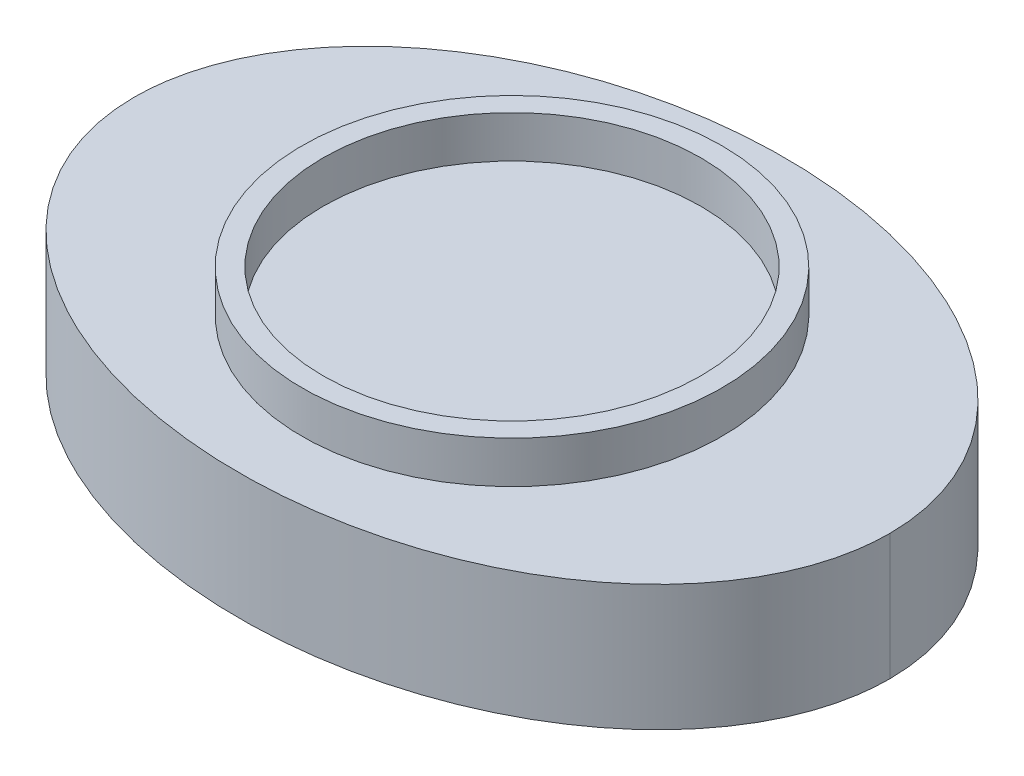
ISO-10303-21;
HEADER;
FILE_DESCRIPTION(('STEP AP214'),'2;1');
FILE_NAME('part.step','',(''),(''),'','','');
FILE_SCHEMA(('AUTOMOTIVE_DESIGN { 1 0 10303 214 1 1 1 1 }'));
ENDSEC;
DATA;
#1=APPLICATION_CONTEXT('core data for automotive mechanical design processes');
#2=APPLICATION_PROTOCOL_DEFINITION('international standard','automotive_design',2000,#1);
#3=PRODUCT_CONTEXT('',#1,'mechanical');
#4=PRODUCT('Part','Part','',(#3));
#5=PRODUCT_RELATED_PRODUCT_CATEGORY('part','',(#4));
#6=PRODUCT_DEFINITION_FORMATION('','',#4);
#7=PRODUCT_DEFINITION_CONTEXT('part definition',#1,'design');
#8=PRODUCT_DEFINITION('design','',#6,#7);
#9=PRODUCT_DEFINITION_SHAPE('','',#8);
#10=(LENGTH_UNIT() NAMED_UNIT(*) SI_UNIT(.MILLI.,.METRE.));
#11=(NAMED_UNIT(*) PLANE_ANGLE_UNIT() SI_UNIT($,.RADIAN.));
#12=(NAMED_UNIT(*) SI_UNIT($,.STERADIAN.) SOLID_ANGLE_UNIT());
#13=UNCERTAINTY_MEASURE_WITH_UNIT(LENGTH_MEASURE(1.E-05),#10,'distance_accuracy_value','');
#14=(GEOMETRIC_REPRESENTATION_CONTEXT(3) GLOBAL_UNCERTAINTY_ASSIGNED_CONTEXT((#13)) GLOBAL_UNIT_ASSIGNED_CONTEXT((#10,
#11,#12)) REPRESENTATION_CONTEXT('',''));
#15=CARTESIAN_POINT('',(0.,0.,0.));
#16=DIRECTION('',(0.,0.,1.));
#17=DIRECTION('',(1.,0.,0.));
#18=AXIS2_PLACEMENT_3D('',#15,#16,#17);
#19=CARTESIAN_POINT('',(0.,3.,0.));
#20=DIRECTION('',(0.,1.,0.));
#21=DIRECTION('',(0.,0.,1.));
#22=AXIS2_PLACEMENT_3D('',#19,#20,#21);
#23=PLANE('',#22);
#24=CARTESIAN_POINT('',(0.,3.,0.));
#25=DIRECTION('',(0.,-1.,0.));
#26=DIRECTION('',(0.,0.,-1.));
#27=AXIS2_PLACEMENT_3D('',#24,#25,#26);
#28=CIRCLE('',#27,4.5);
#29=CARTESIAN_POINT('',(0.,3.,-4.5));
#30=VERTEX_POINT('',#29);
#31=EDGE_CURVE('E20',#30,#30,#28,.F.);
#32=ORIENTED_EDGE('',*,*,#31,.T.);
#33=EDGE_LOOP('',(#32));
#34=FACE_BOUND('',#33,.T.);
#35=ADVANCED_FACE('F17',(#34),#23,.T.);
#36=CARTESIAN_POINT('',(0.,4.,0.));
#37=DIRECTION('',(0.,-1.,0.));
#38=DIRECTION('',(0.,0.,-1.));
#39=AXIS2_PLACEMENT_3D('',#36,#37,#38);
#40=CYLINDRICAL_SURFACE('',#39,4.5);
#41=ORIENTED_EDGE('',*,*,#31,.F.);
#42=EDGE_LOOP('',(#41));
#43=FACE_BOUND('',#42,.T.);
#44=CARTESIAN_POINT('',(0.,4.,0.));
#45=DIRECTION('',(0.,-1.,0.));
#46=DIRECTION('',(0.,0.,-1.));
#47=AXIS2_PLACEMENT_3D('',#44,#45,#46);
#48=CIRCLE('',#47,4.5);
#49=CARTESIAN_POINT('',(0.,4.,-4.5));
#50=VERTEX_POINT('',#49);
#51=EDGE_CURVE('E111',#50,#50,#48,.T.);
#52=ORIENTED_EDGE('',*,*,#51,.F.);
#53=EDGE_LOOP('',(#52));
#54=FACE_BOUND('',#53,.T.);
#55=ADVANCED_FACE('F119',(#43,#54),#40,.F.);
#56=CARTESIAN_POINT('',(0.,4.,0.));
#57=DIRECTION('',(0.,1.,0.));
#58=DIRECTION('',(0.,0.,1.));
#59=AXIS2_PLACEMENT_3D('',#56,#57,#58);
#60=PLANE('',#59);
#61=CARTESIAN_POINT('',(0.,4.,0.));
#62=DIRECTION('',(0.,-1.,0.));
#63=DIRECTION('',(0.,0.,-1.));
#64=AXIS2_PLACEMENT_3D('',#61,#62,#63);
#65=CIRCLE('',#64,5.);
#66=CARTESIAN_POINT('',(0.,4.,-5.));
#67=VERTEX_POINT('',#66);
#68=EDGE_CURVE('E109',#67,#67,#65,.T.);
#69=ORIENTED_EDGE('',*,*,#68,.F.);
#70=EDGE_LOOP('',(#69));
#71=FACE_BOUND('',#70,.T.);
#72=ORIENTED_EDGE('',*,*,#51,.T.);
#73=EDGE_LOOP('',(#72));
#74=FACE_BOUND('',#73,.T.);
#75=ADVANCED_FACE('F122',(#71,#74),#60,.T.);
#76=CARTESIAN_POINT('',(0.,4.,0.));
#77=DIRECTION('',(0.,-1.,0.));
#78=DIRECTION('',(0.,0.,-1.));
#79=AXIS2_PLACEMENT_3D('',#76,#77,#78);
#80=CYLINDRICAL_SURFACE('',#79,5.);
#81=ORIENTED_EDGE('',*,*,#68,.T.);
#82=EDGE_LOOP('',(#81));
#83=FACE_BOUND('',#82,.T.);
#84=CARTESIAN_POINT('',(0.,3.,0.));
#85=DIRECTION('',(0.,-1.,0.));
#86=DIRECTION('',(0.,0.,-1.));
#87=AXIS2_PLACEMENT_3D('',#84,#85,#86);
#88=CIRCLE('',#87,5.);
#89=CARTESIAN_POINT('',(0.,3.,-5.));
#90=VERTEX_POINT('',#89);
#91=EDGE_CURVE('E50',#90,#90,#88,.T.);
#92=ORIENTED_EDGE('',*,*,#91,.F.);
#93=EDGE_LOOP('',(#92));
#94=FACE_BOUND('',#93,.T.);
#95=ADVANCED_FACE('F87',(#83,#94),#80,.T.);
#96=CARTESIAN_POINT('',(0.,3.,0.));
#97=DIRECTION('',(0.,1.,0.));
#98=DIRECTION('',(0.,0.,1.));
#99=AXIS2_PLACEMENT_3D('',#96,#97,#98);
#100=PLANE('',#99);
#101=CARTESIAN_POINT('',(-9.,3.,0.));
#102=CARTESIAN_POINT('',(-9.00002893902373,3.,0.127549969773818));
#103=CARTESIAN_POINT('',(-8.99480285753977,3.,0.255088442349577));
#104=CARTESIAN_POINT('',(-8.97405677653986,3.,0.509268234967433));
#105=CARTESIAN_POINT('',(-8.95854151547113,3.,0.635909940874519));
#106=CARTESIAN_POINT('',(-8.91754170299,3.,0.886874540956104));
#107=CARTESIAN_POINT('',(-8.89211039070337,3.,1.01120616419595));
#108=CARTESIAN_POINT('',(-8.83166230154398,3.,1.25752382151843));
#109=CARTESIAN_POINT('',(-8.79664440855546,3.,1.37950958071336));
#110=CARTESIAN_POINT('',(-8.7151097747714,3.,1.6277957992692));
#111=CARTESIAN_POINT('',(-8.66802458173893,3.,1.75390943564062));
#112=CARTESIAN_POINT('',(-8.56427960835994,3.,2.00218027016195));
#113=CARTESIAN_POINT('',(-8.50761592368228,3.,2.12433583064929));
#114=CARTESIAN_POINT('',(-8.38538465675982,3.,2.36429308555631));
#115=CARTESIAN_POINT('',(-8.31980587464736,3.,2.48208906242689));
#116=CARTESIAN_POINT('',(-8.18055126592551,3.,2.71280343353903));
#117=CARTESIAN_POINT('',(-8.10687375974244,3.,2.82572080923032));
#118=CARTESIAN_POINT('',(-7.91914130645172,3.,3.09351359722164));
#119=CARTESIAN_POINT('',(-7.8012737099325,3.,3.24572913228562));
#120=CARTESIAN_POINT('',(-7.55263077438454,3.,3.53922546808878));
#121=CARTESIAN_POINT('',(-7.42185106192365,3.,3.68050253477731));
#122=CARTESIAN_POINT('',(-7.14904461260543,3.,3.95215975284729));
#123=CARTESIAN_POINT('',(-7.00700105090136,3.,4.08252298159973));
#124=CARTESIAN_POINT('',(-6.71354418248354,3.,4.33211408695893));
#125=CARTESIAN_POINT('',(-6.56213060655358,3.,4.45134164337199));
#126=CARTESIAN_POINT('',(-5.98486752053776,3.,4.87390377353896));
#127=CARTESIAN_POINT('',(-5.53312837335843,3.,5.14283333892189));
#128=CARTESIAN_POINT('',(-4.82875295429743,3.,5.48908674365101));
#129=CARTESIAN_POINT('',(-4.58924076916107,3.,5.59506026843592));
#130=CARTESIAN_POINT('',(-4.10284419889853,3.,5.78876711024874));
#131=CARTESIAN_POINT('',(-3.8559597739903,3.,5.87650032882804));
#132=CARTESIAN_POINT('',(-3.28738588736724,3.,6.05609619410672));
#133=CARTESIAN_POINT('',(-2.96393184254623,3.,6.14236152852256));
#134=CARTESIAN_POINT('',(-2.31079710186416,3.,6.28693886006433));
#135=CARTESIAN_POINT('',(-1.98111477460052,3.,6.34524342474886));
#136=CARTESIAN_POINT('',(-1.31779363834561,3.,6.43456406744096));
#137=CARTESIAN_POINT('',(-0.984151566211739,3.,6.46555578799902));
#138=CARTESIAN_POINT('',(-0.315495902124826,3.,6.50051399755586));
#139=CARTESIAN_POINT('',(0.0195175582765885,3.,6.50448302063715));
#140=CARTESIAN_POINT('',(0.691686946942835,3.,6.48536572639496));
#141=CARTESIAN_POINT('',(1.02883625147836,3.,6.46204442015333));
#142=CARTESIAN_POINT('',(1.70013170767236,3.,6.38768200552451));
#143=CARTESIAN_POINT('',(2.03427744332757,3.,6.33663711568966));
#144=CARTESIAN_POINT('',(2.69663514364929,3.,6.20631634253648));
#145=CARTESIAN_POINT('',(3.02485361104446,3.,6.1270736563876));
#146=CARTESIAN_POINT('',(3.67282004815529,3.,5.9394673345651));
#147=CARTESIAN_POINT('',(3.99257133021226,3.,5.8311152769618));
#148=CARTESIAN_POINT('',(4.52762321387958,3.,5.62054636433278));
#149=CARTESIAN_POINT('',(4.7459342013085,3.,5.52593262490374));
#150=CARTESIAN_POINT('',(5.17516484339017,3.,5.3211573789485));
#151=CARTESIAN_POINT('',(5.38608490826475,3.,5.21099673704098));
#152=CARTESIAN_POINT('',(5.79851991341557,3.,4.97475947100421));
#153=CARTESIAN_POINT('',(6.00004653621213,3.,4.84870338069396));
#154=CARTESIAN_POINT('',(6.39181585119987,3.,4.5801489730918));
#155=CARTESIAN_POINT('',(6.58205736370133,3.,4.43764894140125));
#156=CARTESIAN_POINT('',(7.04260127859859,3.,4.0584794835897));
#157=CARTESIAN_POINT('',(7.30420608662375,3.,3.81086896169006));
#158=CARTESIAN_POINT('',(7.6644087559008,3.,3.41095316865324));
#159=CARTESIAN_POINT('',(7.77910148448862,3.,3.27290933884175));
#160=CARTESIAN_POINT('',(7.99626194601808,3.,2.98746638551199));
#161=CARTESIAN_POINT('',(8.09873227529421,3.,2.84006925908937));
#162=CARTESIAN_POINT('',(8.27185548715404,3.,2.56482220242746));
#163=CARTESIAN_POINT('',(8.34487736912533,3.,2.43845797556506));
#164=CARTESIAN_POINT('',(8.48070646025307,3.,2.18036227635893));
#165=CARTESIAN_POINT('',(8.54351577193726,3.,2.04863191577719));
#166=CARTESIAN_POINT('',(8.65789296819306,3.,1.78061302067102));
#167=CARTESIAN_POINT('',(8.70947908535073,3.,1.64433230028945));
#168=CARTESIAN_POINT('',(8.80065893827632,3.,1.36786831157127));
#169=CARTESIAN_POINT('',(8.84025630395741,3.,1.22768623853759));
#170=CARTESIAN_POINT('',(8.91517631824024,3.,0.908323293058997));
#171=CARTESIAN_POINT('',(8.94687056617571,3.,0.728264830157022));
#172=CARTESIAN_POINT('',(8.9786849964936,3.,0.456300640878521));
#173=CARTESIAN_POINT('',(8.98666873348374,3.,0.365248652577104));
#174=CARTESIAN_POINT('',(8.99732845214193,3.,0.182805829338362));
#175=CARTESIAN_POINT('',(9.00000275254287,3.,0.09141489624717));
#176=CARTESIAN_POINT('',(9.,3.,0.));
#177=B_SPLINE_CURVE_WITH_KNOTS('',3,(#101,#102,#103,#104,#105,#106,#107,#108,#109,#110,#111,
#112,#113,#114,#115,#116,#117,#118,#119,#120,#121,#122,#123,#124,#125,#126,#127,#128,#129,#130,
#131,#132,#133,#134,#135,#136,#137,#138,#139,#140,#141,#142,#143,#144,#145,#146,#147,#148,#149,
#150,#151,#152,#153,#154,#155,#156,#157,#158,#159,#160,#161,#162,#163,#164,#165,#166,#167,#168,
#169,#170,#171,#172,#173,#174,#175,#176),.UNSPECIFIED.,.F.,.F.,(4,2,2,2,2,2,2,2,2,2,2,2,2,2,2,2,
2,2,2,2,2,2,2,2,2,2,2,2,2,2,2,2,2,2,2,2,2,4),(0.,0.38252470016884,0.764873359524244,
1.14519685143168,1.52556464127154,1.92899427498546,2.33258875071799,2.73669502252107,
3.14088525957392,3.71757450897498,4.2944597619221,4.87222355665316,5.4500039592194,
7.01732305260337,7.80259398828204,8.58786916220254,9.59083290471617,10.5940631042349,
11.5981870764189,12.6022168845009,13.6149561014368,14.6278334889105,15.6395223432052,
16.6508093988086,17.3640528070148,18.0772565648314,18.7895482639452,19.5019142917767,
20.5778794682944,21.1157812748079,21.6535686136459,22.0909910800023,22.5283233770339,
22.964939813233,23.4014239196929,23.9485593296398,24.2226310475784,24.4967895382493),.UNSPECIFIED.);
#178=CARTESIAN_POINT('',(-9.,3.,0.));
#179=VERTEX_POINT('',#178);
#180=CARTESIAN_POINT('',(9.,3.,0.));
#181=VERTEX_POINT('',#180);
#182=EDGE_CURVE('E43',#179,#181,#177,.T.);
#183=ORIENTED_EDGE('',*,*,#182,.T.);
#184=CARTESIAN_POINT('',(9.,3.,0.));
#185=CARTESIAN_POINT('',(9.00002893902373,3.,-0.127549969773818));
#186=CARTESIAN_POINT('',(8.99480285753977,3.,-0.255088442349576));
#187=CARTESIAN_POINT('',(8.97405677653986,3.,-0.509268234967432));
#188=CARTESIAN_POINT('',(8.95854151547113,3.,-0.635909940874518));
#189=CARTESIAN_POINT('',(8.91754170299,3.,-0.886874540956103));
#190=CARTESIAN_POINT('',(8.89211039070337,3.,-1.01120616419595));
#191=CARTESIAN_POINT('',(8.83166230154398,3.,-1.25752382151843));
#192=CARTESIAN_POINT('',(8.79664440855546,3.,-1.37950958071336));
#193=CARTESIAN_POINT('',(8.7151097747714,3.,-1.6277957992692));
#194=CARTESIAN_POINT('',(8.66802458173892,3.,-1.75390943564062));
#195=CARTESIAN_POINT('',(8.56427960835994,3.,-2.00218027016195));
#196=CARTESIAN_POINT('',(8.50761592368228,3.,-2.12433583064929));
#197=CARTESIAN_POINT('',(8.38538465675982,3.,-2.36429308555631));
#198=CARTESIAN_POINT('',(8.31980587464736,3.,-2.48208906242689));
#199=CARTESIAN_POINT('',(8.18055126592551,3.,-2.71280343353903));
#200=CARTESIAN_POINT('',(8.10687375974244,3.,-2.82572080923032));
#201=CARTESIAN_POINT('',(7.91914130645172,3.,-3.09351359722164));
#202=CARTESIAN_POINT('',(7.8012737099325,3.,-3.24572913228561));
#203=CARTESIAN_POINT('',(7.55263077438454,3.,-3.53922546808878));
#204=CARTESIAN_POINT('',(7.42185106192365,3.,-3.68050253477731));
#205=CARTESIAN_POINT('',(7.14904461260543,3.,-3.95215975284729));
#206=CARTESIAN_POINT('',(7.00700105090136,3.,-4.08252298159973));
#207=CARTESIAN_POINT('',(6.71354418248353,3.,-4.33211408695893));
#208=CARTESIAN_POINT('',(6.56213060655358,3.,-4.45134164337199));
#209=CARTESIAN_POINT('',(5.98486752053776,3.,-4.87390377353897));
#210=CARTESIAN_POINT('',(5.53312837335843,3.,-5.14283333892189));
#211=CARTESIAN_POINT('',(4.82875295429742,3.,-5.48908674365101));
#212=CARTESIAN_POINT('',(4.58924076916107,3.,-5.59506026843592));
#213=CARTESIAN_POINT('',(4.10284419889853,3.,-5.78876711024875));
#214=CARTESIAN_POINT('',(3.8559597739903,3.,-5.87650032882804));
#215=CARTESIAN_POINT('',(3.28738588736723,3.,-6.05609619410672));
#216=CARTESIAN_POINT('',(2.96393184254623,3.,-6.14236152852256));
#217=CARTESIAN_POINT('',(2.31079710186416,3.,-6.28693886006433));
#218=CARTESIAN_POINT('',(1.98111477460052,3.,-6.34524342474886));
#219=CARTESIAN_POINT('',(1.3177936383456,3.,-6.43456406744096));
#220=CARTESIAN_POINT('',(0.984151566211728,3.,-6.46555578799902));
#221=CARTESIAN_POINT('',(0.315495902124813,3.,-6.50051399755586));
#222=CARTESIAN_POINT('',(-0.0195175582766024,3.,-6.50448302063715));
#223=CARTESIAN_POINT('',(-0.69168694694285,3.,-6.48536572639496));
#224=CARTESIAN_POINT('',(-1.02883625147838,3.,-6.46204442015333));
#225=CARTESIAN_POINT('',(-1.70013170767238,3.,-6.38768200552451));
#226=CARTESIAN_POINT('',(-2.03427744332758,3.,-6.33663711568966));
#227=CARTESIAN_POINT('',(-2.69663514364931,3.,-6.20631634253647));
#228=CARTESIAN_POINT('',(-3.02485361104447,3.,-6.1270736563876));
#229=CARTESIAN_POINT('',(-3.6728200481553,3.,-5.93946733456509));
#230=CARTESIAN_POINT('',(-3.99257133021228,3.,-5.8311152769618));
#231=CARTESIAN_POINT('',(-4.52762321387959,3.,-5.62054636433277));
#232=CARTESIAN_POINT('',(-4.74593420130851,3.,-5.52593262490374));
#233=CARTESIAN_POINT('',(-5.17516484339018,3.,-5.3211573789485));
#234=CARTESIAN_POINT('',(-5.38608490826476,3.,-5.21099673704097));
#235=CARTESIAN_POINT('',(-5.79851991341559,3.,-4.97475947100421));
#236=CARTESIAN_POINT('',(-6.00004653621214,3.,-4.84870338069396));
#237=CARTESIAN_POINT('',(-6.39181585119988,3.,-4.5801489730918));
#238=CARTESIAN_POINT('',(-6.58205736370134,3.,-4.43764894140124));
#239=CARTESIAN_POINT('',(-7.0426012785986,3.,-4.05847948358969));
#240=CARTESIAN_POINT('',(-7.30420608662375,3.,-3.81086896169005));
#241=CARTESIAN_POINT('',(-7.6644087559008,3.,-3.41095316865323));
#242=CARTESIAN_POINT('',(-7.77910148448863,3.,-3.27290933884174));
#243=CARTESIAN_POINT('',(-7.99626194601809,3.,-2.98746638551198));
#244=CARTESIAN_POINT('',(-8.09873227529422,3.,-2.84006925908936));
#245=CARTESIAN_POINT('',(-8.27185548715404,3.,-2.56482220242745));
#246=CARTESIAN_POINT('',(-8.34487736912533,3.,-2.43845797556505));
#247=CARTESIAN_POINT('',(-8.48070646025307,3.,-2.18036227635892));
#248=CARTESIAN_POINT('',(-8.54351577193727,3.,-2.04863191577718));
#249=CARTESIAN_POINT('',(-8.65789296819306,3.,-1.78061302067101));
#250=CARTESIAN_POINT('',(-8.70947908535074,3.,-1.64433230028944));
#251=CARTESIAN_POINT('',(-8.80065893827632,3.,-1.36786831157126));
#252=CARTESIAN_POINT('',(-8.84025630395742,3.,-1.22768623853758));
#253=CARTESIAN_POINT('',(-8.91517631824024,3.,-0.908323293058989));
#254=CARTESIAN_POINT('',(-8.94687056617571,3.,-0.728264830157016));
#255=CARTESIAN_POINT('',(-8.97868499649361,3.,-0.456300640878517));
#256=CARTESIAN_POINT('',(-8.98666873348374,3.,-0.365248652577101));
#257=CARTESIAN_POINT('',(-8.99732845214193,3.,-0.18280582933836));
#258=CARTESIAN_POINT('',(-9.00000275254287,3.,-0.0914148962471687));
#259=CARTESIAN_POINT('',(-9.,3.,0.));
#260=B_SPLINE_CURVE_WITH_KNOTS('',3,(#184,#185,#186,#187,#188,#189,#190,#191,#192,#193,#194,
#195,#196,#197,#198,#199,#200,#201,#202,#203,#204,#205,#206,#207,#208,#209,#210,#211,#212,#213,
#214,#215,#216,#217,#218,#219,#220,#221,#222,#223,#224,#225,#226,#227,#228,#229,#230,#231,#232,
#233,#234,#235,#236,#237,#238,#239,#240,#241,#242,#243,#244,#245,#246,#247,#248,#249,#250,#251,
#252,#253,#254,#255,#256,#257,#258,#259),.UNSPECIFIED.,.F.,.F.,(4,2,2,2,2,2,2,2,2,2,2,2,2,2,2,2,
2,2,2,2,2,2,2,2,2,2,2,2,2,2,2,2,2,2,2,2,2,4),(0.,0.38252470016884,0.764873359524244,
1.14519685143168,1.52556464127154,1.92899427498546,2.33258875071799,2.73669502252107,
3.14088525957393,3.71757450897499,4.2944597619221,4.87222355665317,5.4500039592194,
7.01732305260337,7.80259398828204,8.58786916220254,9.59083290471618,10.5940631042349,
11.598187076419,12.6022168845009,13.6149561014368,14.6278334889105,15.6395223432052,
16.6508093988086,17.3640528070149,18.0772565648314,18.7895482639452,19.5019142917767,
20.5778794682944,21.1157812748079,21.6535686136459,22.0909910800023,22.5283233770339,
22.964939813233,23.4014239196929,23.9485593296398,24.2226310475784,24.4967895382493),.UNSPECIFIED.);
#261=EDGE_CURVE('E49',#181,#179,#260,.T.);
#262=ORIENTED_EDGE('',*,*,#261,.T.);
#263=EDGE_LOOP('',(#183,#262));
#264=FACE_BOUND('',#263,.T.);
#265=ORIENTED_EDGE('',*,*,#91,.T.);
#266=EDGE_LOOP('',(#265));
#267=FACE_BOUND('',#266,.T.);
#268=ADVANCED_FACE('F47',(#264,#267),#100,.T.);
#269=CARTESIAN_POINT('',(-9.,3.,0.));
#270=CARTESIAN_POINT('',(-9.,0.,0.));
#271=CARTESIAN_POINT('',(-9.,3.,13.));
#272=CARTESIAN_POINT('',(-9.,0.,13.));
#273=CARTESIAN_POINT('',(9.,3.,13.));
#274=CARTESIAN_POINT('',(9.,0.,13.));
#275=CARTESIAN_POINT('',(9.,3.,0.));
#276=CARTESIAN_POINT('',(9.,0.,0.));
#277=(BOUNDED_SURFACE() B_SPLINE_SURFACE(3,1,((#269,#270),(#271,#272),(#273,#274),(#275,#276)),
.UNSPECIFIED.,.F.,.F.,.F.) B_SPLINE_SURFACE_WITH_KNOTS((4,4),(2,2),(0.,1.),(0.,1.),
.UNSPECIFIED.) GEOMETRIC_REPRESENTATION_ITEM() RATIONAL_B_SPLINE_SURFACE(((1.,1.),
(0.333333333333,0.333333333333),(0.333333333333,0.333333333333),(1.,1.))) REPRESENTATION_ITEM('') SURFACE());
#278=CARTESIAN_POINT('',(-9.,0.,0.));
#279=CARTESIAN_POINT('',(-9.00002893902373,0.,0.127549969773818));
#280=CARTESIAN_POINT('',(-8.99480285753976,0.,0.255088442349577));
#281=CARTESIAN_POINT('',(-8.97405677653986,0.,0.509268234967433));
#282=CARTESIAN_POINT('',(-8.95854151547114,0.,0.635909940874519));
#283=CARTESIAN_POINT('',(-8.91754170299,0.,0.886874540956104));
#284=CARTESIAN_POINT('',(-8.89211039070337,0.,1.01120616419595));
#285=CARTESIAN_POINT('',(-8.83166230154398,0.,1.25752382151843));
#286=CARTESIAN_POINT('',(-8.79664440855546,0.,1.37950958071336));
#287=CARTESIAN_POINT('',(-8.7151097747714,0.,1.6277957992692));
#288=CARTESIAN_POINT('',(-8.66802458173893,0.,1.75390943564062));
#289=CARTESIAN_POINT('',(-8.56427960835994,0.,2.00218027016195));
#290=CARTESIAN_POINT('',(-8.50761592368228,0.,2.12433583064929));
#291=CARTESIAN_POINT('',(-8.38538465675982,0.,2.36429308555631));
#292=CARTESIAN_POINT('',(-8.31980587464736,0.,2.48208906242689));
#293=CARTESIAN_POINT('',(-8.18055126592551,0.,2.71280343353903));
#294=CARTESIAN_POINT('',(-8.10687375974244,0.,2.82572080923032));
#295=CARTESIAN_POINT('',(-7.91914130645172,0.,3.09351359722164));
#296=CARTESIAN_POINT('',(-7.8012737099325,0.,3.24572913228562));
#297=CARTESIAN_POINT('',(-7.55263077438454,0.,3.53922546808878));
#298=CARTESIAN_POINT('',(-7.42185106192365,0.,3.68050253477731));
#299=CARTESIAN_POINT('',(-7.14904461260543,0.,3.95215975284729));
#300=CARTESIAN_POINT('',(-7.00700105090136,0.,4.08252298159973));
#301=CARTESIAN_POINT('',(-6.71354418248354,0.,4.33211408695893));
#302=CARTESIAN_POINT('',(-6.56213060655358,0.,4.45134164337199));
#303=CARTESIAN_POINT('',(-5.98486752053776,0.,4.87390377353896));
#304=CARTESIAN_POINT('',(-5.53312837335843,0.,5.14283333892189));
#305=CARTESIAN_POINT('',(-4.82875295429743,0.,5.48908674365101));
#306=CARTESIAN_POINT('',(-4.58924076916107,0.,5.59506026843592));
#307=CARTESIAN_POINT('',(-4.10284419889853,0.,5.78876711024874));
#308=CARTESIAN_POINT('',(-3.8559597739903,0.,5.87650032882804));
#309=CARTESIAN_POINT('',(-3.28738588736724,0.,6.05609619410672));
#310=CARTESIAN_POINT('',(-2.96393184254623,0.,6.14236152852256));
#311=CARTESIAN_POINT('',(-2.31079710186416,0.,6.28693886006433));
#312=CARTESIAN_POINT('',(-1.98111477460052,0.,6.34524342474886));
#313=CARTESIAN_POINT('',(-1.31779363834561,0.,6.43456406744096));
#314=CARTESIAN_POINT('',(-0.984151566211739,0.,6.46555578799902));
#315=CARTESIAN_POINT('',(-0.315495902124826,0.,6.50051399755586));
#316=CARTESIAN_POINT('',(0.0195175582765885,0.,6.50448302063715));
#317=CARTESIAN_POINT('',(0.691686946942835,0.,6.48536572639496));
#318=CARTESIAN_POINT('',(1.02883625147836,0.,6.46204442015333));
#319=CARTESIAN_POINT('',(1.70013170767236,0.,6.38768200552451));
#320=CARTESIAN_POINT('',(2.03427744332757,0.,6.33663711568966));
#321=CARTESIAN_POINT('',(2.69663514364929,0.,6.20631634253648));
#322=CARTESIAN_POINT('',(3.02485361104446,0.,6.1270736563876));
#323=CARTESIAN_POINT('',(3.67282004815528,0.,5.9394673345651));
#324=CARTESIAN_POINT('',(3.99257133021226,0.,5.8311152769618));
#325=CARTESIAN_POINT('',(4.52762321387958,0.,5.62054636433278));
#326=CARTESIAN_POINT('',(4.7459342013085,0.,5.52593262490374));
#327=CARTESIAN_POINT('',(5.17516484339017,0.,5.3211573789485));
#328=CARTESIAN_POINT('',(5.38608490826475,0.,5.21099673704098));
#329=CARTESIAN_POINT('',(5.79851991341557,0.,4.97475947100421));
#330=CARTESIAN_POINT('',(6.00004653621213,0.,4.84870338069397));
#331=CARTESIAN_POINT('',(6.39181585119987,0.,4.5801489730918));
#332=CARTESIAN_POINT('',(6.58205736370133,0.,4.43764894140125));
#333=CARTESIAN_POINT('',(7.04260127859859,0.,4.05847948358969));
#334=CARTESIAN_POINT('',(7.30420608662375,0.,3.81086896169006));
#335=CARTESIAN_POINT('',(7.6644087559008,0.,3.41095316865324));
#336=CARTESIAN_POINT('',(7.77910148448862,0.,3.27290933884175));
#337=CARTESIAN_POINT('',(7.99626194601808,0.,2.98746638551199));
#338=CARTESIAN_POINT('',(8.09873227529421,0.,2.84006925908937));
#339=CARTESIAN_POINT('',(8.27185548715404,0.,2.56482220242746));
#340=CARTESIAN_POINT('',(8.34487736912532,0.,2.43845797556506));
#341=CARTESIAN_POINT('',(8.48070646025306,0.,2.18036227635893));
#342=CARTESIAN_POINT('',(8.54351577193726,0.,2.04863191577719));
#343=CARTESIAN_POINT('',(8.65789296819306,0.,1.78061302067102));
#344=CARTESIAN_POINT('',(8.70947908535073,0.,1.64433230028945));
#345=CARTESIAN_POINT('',(8.80065893827632,0.,1.36786831157127));
#346=CARTESIAN_POINT('',(8.84025630395741,0.,1.22768623853759));
#347=CARTESIAN_POINT('',(8.91517631824024,0.,0.908323293058997));
#348=CARTESIAN_POINT('',(8.94687056617571,0.,0.728264830157022));
#349=CARTESIAN_POINT('',(8.9786849964936,0.,0.456300640878521));
#350=CARTESIAN_POINT('',(8.98666873348374,0.,0.365248652577104));
#351=CARTESIAN_POINT('',(8.99732845214193,0.,0.182805829338362));
#352=CARTESIAN_POINT('',(9.00000275254287,0.,0.09141489624717));
#353=CARTESIAN_POINT('',(9.,0.,0.));
#354=B_SPLINE_CURVE_WITH_KNOTS('',3,(#278,#279,#280,#281,#282,#283,#284,#285,#286,#287,#288,
#289,#290,#291,#292,#293,#294,#295,#296,#297,#298,#299,#300,#301,#302,#303,#304,#305,#306,#307,
#308,#309,#310,#311,#312,#313,#314,#315,#316,#317,#318,#319,#320,#321,#322,#323,#324,#325,#326,
#327,#328,#329,#330,#331,#332,#333,#334,#335,#336,#337,#338,#339,#340,#341,#342,#343,#344,#345,
#346,#347,#348,#349,#350,#351,#352,#353),.UNSPECIFIED.,.F.,.F.,(4,2,2,2,2,2,2,2,2,2,2,2,2,2,2,2,
2,2,2,2,2,2,2,2,2,2,2,2,2,2,2,2,2,2,2,2,2,4),(0.,0.38252470016884,0.764873359524244,
1.14519685143168,1.52556464127154,1.92899427498546,2.33258875071799,2.73669502252107,
3.14088525957392,3.71757450897498,4.2944597619221,4.87222355665316,5.4500039592194,
7.01732305260337,7.80259398828204,8.58786916220254,9.59083290471617,10.5940631042349,
11.5981870764189,12.6022168845009,13.6149561014368,14.6278334889105,15.6395223432052,
16.6508093988086,17.3640528070148,18.0772565648314,18.7895482639452,19.5019142917767,
20.5778794682944,21.1157812748079,21.6535686136459,22.0909910800023,22.5283233770339,
22.964939813233,23.4014239196929,23.9485593296398,24.2226310475784,24.4967895382493),.UNSPECIFIED.);
#355=CARTESIAN_POINT('',(-9.,0.,0.));
#356=VERTEX_POINT('',#355);
#357=CARTESIAN_POINT('',(9.,0.,0.));
#358=VERTEX_POINT('',#357);
#359=EDGE_CURVE('E26',#356,#358,#354,.T.);
#360=DIRECTION('',(0.,1.,0.));
#361=VECTOR('',#360,1.);
#362=CARTESIAN_POINT('',(9.,1.5,0.));
#363=LINE('',#362,#361);
#364=EDGE_CURVE('E34',#358,#181,#363,.T.);
#365=DIRECTION('',(0.,-1.,0.));
#366=VECTOR('',#365,1.);
#367=CARTESIAN_POINT('',(-9.,1.5,0.));
#368=LINE('',#367,#366);
#369=EDGE_CURVE('E53',#179,#356,#368,.T.);
#370=ORIENTED_EDGE('',*,*,#359,.T.);
#371=ORIENTED_EDGE('',*,*,#364,.T.);
#372=ORIENTED_EDGE('',*,*,#182,.F.);
#373=ORIENTED_EDGE('',*,*,#369,.T.);
#374=EDGE_LOOP('',(#370,#371,#372,#373));
#375=FACE_BOUND('',#374,.T.);
#376=ADVANCED_FACE('F56',(#375),#277,.F.);
#377=CARTESIAN_POINT('',(9.,3.,0.));
#378=CARTESIAN_POINT('',(9.,0.,0.));
#379=CARTESIAN_POINT('',(9.,3.,-13.));
#380=CARTESIAN_POINT('',(9.,0.,-13.));
#381=CARTESIAN_POINT('',(-9.,3.,-13.));
#382=CARTESIAN_POINT('',(-9.,0.,-13.));
#383=CARTESIAN_POINT('',(-9.,3.,0.));
#384=CARTESIAN_POINT('',(-9.,0.,0.));
#385=(BOUNDED_SURFACE() B_SPLINE_SURFACE(3,1,((#377,#378),(#379,#380),(#381,#382),(#383,#384)),
.UNSPECIFIED.,.F.,.F.,.F.) B_SPLINE_SURFACE_WITH_KNOTS((4,4),(2,2),(0.,1.),(0.,1.),
.UNSPECIFIED.) GEOMETRIC_REPRESENTATION_ITEM() RATIONAL_B_SPLINE_SURFACE(((1.,1.),
(0.333333333333,0.333333333333),(0.333333333333,0.333333333333),(1.,1.))) REPRESENTATION_ITEM('') SURFACE());
#386=CARTESIAN_POINT('',(9.,0.,0.));
#387=CARTESIAN_POINT('',(9.00002893902373,0.,-0.127549969773818));
#388=CARTESIAN_POINT('',(8.99480285753977,0.,-0.255088442349576));
#389=CARTESIAN_POINT('',(8.97405677653986,0.,-0.509268234967432));
#390=CARTESIAN_POINT('',(8.95854151547113,0.,-0.635909940874518));
#391=CARTESIAN_POINT('',(8.91754170299,0.,-0.886874540956103));
#392=CARTESIAN_POINT('',(8.89211039070337,0.,-1.01120616419595));
#393=CARTESIAN_POINT('',(8.83166230154398,0.,-1.25752382151843));
#394=CARTESIAN_POINT('',(8.79664440855546,0.,-1.37950958071336));
#395=CARTESIAN_POINT('',(8.7151097747714,0.,-1.6277957992692));
#396=CARTESIAN_POINT('',(8.66802458173893,0.,-1.75390943564062));
#397=CARTESIAN_POINT('',(8.56427960835994,0.,-2.00218027016195));
#398=CARTESIAN_POINT('',(8.50761592368228,0.,-2.12433583064929));
#399=CARTESIAN_POINT('',(8.38538465675982,0.,-2.36429308555631));
#400=CARTESIAN_POINT('',(8.31980587464736,0.,-2.48208906242689));
#401=CARTESIAN_POINT('',(8.18055126592551,0.,-2.71280343353903));
#402=CARTESIAN_POINT('',(8.10687375974244,0.,-2.82572080923032));
#403=CARTESIAN_POINT('',(7.91914130645172,0.,-3.09351359722164));
#404=CARTESIAN_POINT('',(7.8012737099325,0.,-3.24572913228561));
#405=CARTESIAN_POINT('',(7.55263077438454,0.,-3.53922546808878));
#406=CARTESIAN_POINT('',(7.42185106192365,0.,-3.68050253477731));
#407=CARTESIAN_POINT('',(7.14904461260543,0.,-3.95215975284729));
#408=CARTESIAN_POINT('',(7.00700105090136,0.,-4.08252298159973));
#409=CARTESIAN_POINT('',(6.71354418248353,0.,-4.33211408695893));
#410=CARTESIAN_POINT('',(6.56213060655358,0.,-4.45134164337199));
#411=CARTESIAN_POINT('',(5.98486752053776,0.,-4.87390377353897));
#412=CARTESIAN_POINT('',(5.53312837335843,0.,-5.14283333892189));
#413=CARTESIAN_POINT('',(4.82875295429742,0.,-5.48908674365101));
#414=CARTESIAN_POINT('',(4.58924076916107,0.,-5.59506026843592));
#415=CARTESIAN_POINT('',(4.10284419889853,0.,-5.78876711024875));
#416=CARTESIAN_POINT('',(3.8559597739903,0.,-5.87650032882804));
#417=CARTESIAN_POINT('',(3.28738588736723,0.,-6.05609619410672));
#418=CARTESIAN_POINT('',(2.96393184254623,0.,-6.14236152852256));
#419=CARTESIAN_POINT('',(2.31079710186416,0.,-6.28693886006433));
#420=CARTESIAN_POINT('',(1.98111477460052,0.,-6.34524342474886));
#421=CARTESIAN_POINT('',(1.3177936383456,0.,-6.43456406744096));
#422=CARTESIAN_POINT('',(0.984151566211728,0.,-6.46555578799902));
#423=CARTESIAN_POINT('',(0.315495902124813,0.,-6.50051399755586));
#424=CARTESIAN_POINT('',(-0.0195175582766024,0.,-6.50448302063715));
#425=CARTESIAN_POINT('',(-0.69168694694285,0.,-6.48536572639496));
#426=CARTESIAN_POINT('',(-1.02883625147838,0.,-6.46204442015333));
#427=CARTESIAN_POINT('',(-1.70013170767238,0.,-6.38768200552451));
#428=CARTESIAN_POINT('',(-2.03427744332758,0.,-6.33663711568966));
#429=CARTESIAN_POINT('',(-2.69663514364931,0.,-6.20631634253647));
#430=CARTESIAN_POINT('',(-3.02485361104447,0.,-6.1270736563876));
#431=CARTESIAN_POINT('',(-3.6728200481553,0.,-5.93946733456509));
#432=CARTESIAN_POINT('',(-3.99257133021228,0.,-5.8311152769618));
#433=CARTESIAN_POINT('',(-4.52762321387959,0.,-5.62054636433277));
#434=CARTESIAN_POINT('',(-4.74593420130851,0.,-5.52593262490374));
#435=CARTESIAN_POINT('',(-5.17516484339019,0.,-5.3211573789485));
#436=CARTESIAN_POINT('',(-5.38608490826477,0.,-5.21099673704097));
#437=CARTESIAN_POINT('',(-5.79851991341559,0.,-4.9747594710042));
#438=CARTESIAN_POINT('',(-6.00004653621214,0.,-4.84870338069396));
#439=CARTESIAN_POINT('',(-6.39181585119988,0.,-4.5801489730918));
#440=CARTESIAN_POINT('',(-6.58205736370134,0.,-4.43764894140124));
#441=CARTESIAN_POINT('',(-7.0426012785986,0.,-4.05847948358969));
#442=CARTESIAN_POINT('',(-7.30420608662375,0.,-3.81086896169005));
#443=CARTESIAN_POINT('',(-7.6644087559008,0.,-3.41095316865323));
#444=CARTESIAN_POINT('',(-7.77910148448863,0.,-3.27290933884174));
#445=CARTESIAN_POINT('',(-7.99626194601809,0.,-2.98746638551198));
#446=CARTESIAN_POINT('',(-8.09873227529422,0.,-2.84006925908936));
#447=CARTESIAN_POINT('',(-8.27185548715404,0.,-2.56482220242745));
#448=CARTESIAN_POINT('',(-8.34487736912533,0.,-2.43845797556505));
#449=CARTESIAN_POINT('',(-8.48070646025307,0.,-2.18036227635892));
#450=CARTESIAN_POINT('',(-8.54351577193727,0.,-2.04863191577718));
#451=CARTESIAN_POINT('',(-8.65789296819306,0.,-1.78061302067101));
#452=CARTESIAN_POINT('',(-8.70947908535074,0.,-1.64433230028944));
#453=CARTESIAN_POINT('',(-8.80065893827632,0.,-1.36786831157126));
#454=CARTESIAN_POINT('',(-8.84025630395742,0.,-1.22768623853758));
#455=CARTESIAN_POINT('',(-8.91517631824024,0.,-0.908323293058989));
#456=CARTESIAN_POINT('',(-8.94687056617571,0.,-0.728264830157017));
#457=CARTESIAN_POINT('',(-8.97868499649361,0.,-0.456300640878517));
#458=CARTESIAN_POINT('',(-8.98666873348373,0.,-0.365248652577101));
#459=CARTESIAN_POINT('',(-8.99732845214193,0.,-0.18280582933836));
#460=CARTESIAN_POINT('',(-9.00000275254287,0.,-0.0914148962471683));
#461=CARTESIAN_POINT('',(-9.,0.,0.));
#462=B_SPLINE_CURVE_WITH_KNOTS('',3,(#386,#387,#388,#389,#390,#391,#392,#393,#394,#395,#396,
#397,#398,#399,#400,#401,#402,#403,#404,#405,#406,#407,#408,#409,#410,#411,#412,#413,#414,#415,
#416,#417,#418,#419,#420,#421,#422,#423,#424,#425,#426,#427,#428,#429,#430,#431,#432,#433,#434,
#435,#436,#437,#438,#439,#440,#441,#442,#443,#444,#445,#446,#447,#448,#449,#450,#451,#452,#453,
#454,#455,#456,#457,#458,#459,#460,#461),.UNSPECIFIED.,.F.,.F.,(4,2,2,2,2,2,2,2,2,2,2,2,2,2,2,2,
2,2,2,2,2,2,2,2,2,2,2,2,2,2,2,2,2,2,2,2,2,4),(0.,0.38252470016884,0.764873359524244,
1.14519685143168,1.52556464127154,1.92899427498546,2.33258875071799,2.73669502252107,
3.14088525957393,3.71757450897499,4.29445976192211,4.87222355665317,5.4500039592194,
7.01732305260337,7.80259398828204,8.58786916220254,9.59083290471618,10.5940631042349,
11.598187076419,12.6022168845009,13.6149561014368,14.6278334889105,15.6395223432052,
16.6508093988086,17.3640528070149,18.0772565648314,18.7895482639452,19.5019142917767,
20.5778794682944,21.1157812748079,21.6535686136459,22.0909910800023,22.5283233770339,
22.964939813233,23.4014239196929,23.9485593296398,24.2226310475784,24.4967895382493),.UNSPECIFIED.);
#463=EDGE_CURVE('E11',#358,#356,#462,.T.);
#464=ORIENTED_EDGE('',*,*,#369,.F.);
#465=ORIENTED_EDGE('',*,*,#261,.F.);
#466=ORIENTED_EDGE('',*,*,#364,.F.);
#467=ORIENTED_EDGE('',*,*,#463,.T.);
#468=EDGE_LOOP('',(#464,#465,#466,#467));
#469=FACE_BOUND('',#468,.T.);
#470=ADVANCED_FACE('F52',(#469),#385,.F.);
#471=CARTESIAN_POINT('',(0.,0.,0.));
#472=DIRECTION('',(0.,1.,0.));
#473=DIRECTION('',(0.,0.,1.));
#474=AXIS2_PLACEMENT_3D('',#471,#472,#473);
#475=PLANE('',#474);
#476=ORIENTED_EDGE('',*,*,#359,.F.);
#477=ORIENTED_EDGE('',*,*,#463,.F.);
#478=EDGE_LOOP('',(#476,#477));
#479=FACE_BOUND('',#478,.T.);
#480=ADVANCED_FACE('F72',(#479),#475,.F.);
#481=CLOSED_SHELL('',(#35,#55,#75,#95,#268,#376,#470,#480));
#482=MANIFOLD_SOLID_BREP('B1',#481);
#483=ADVANCED_BREP_SHAPE_REPRESENTATION('',(#18,#482),#14);
#484=SHAPE_DEFINITION_REPRESENTATION(#9,#483);
ENDSEC;
END-ISO-10303-21;
